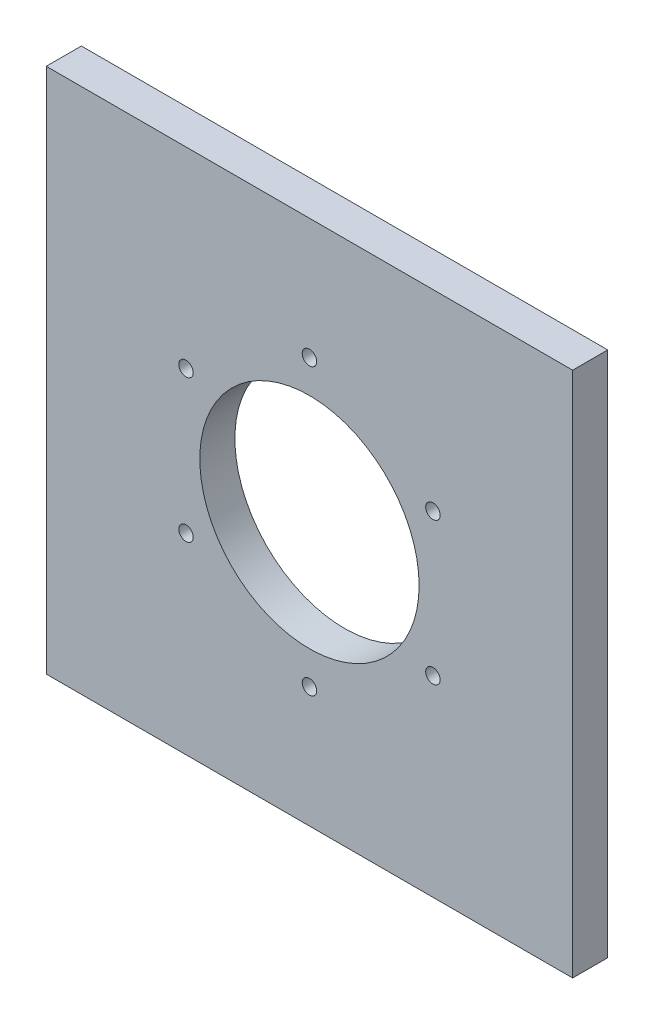
ISO-10303-21;
HEADER;
FILE_DESCRIPTION(('STEP AP214'),'2;1');
FILE_NAME('part.step','',(''),(''),'','','');
FILE_SCHEMA(('AUTOMOTIVE_DESIGN { 1 0 10303 214 1 1 1 1 }'));
ENDSEC;
DATA;
#1=APPLICATION_CONTEXT('core data for automotive mechanical design processes');
#2=APPLICATION_PROTOCOL_DEFINITION('international standard','automotive_design',2000,#1);
#3=PRODUCT_CONTEXT('',#1,'mechanical');
#4=PRODUCT('Part','Part','',(#3));
#5=PRODUCT_RELATED_PRODUCT_CATEGORY('part','',(#4));
#6=PRODUCT_DEFINITION_FORMATION('','',#4);
#7=PRODUCT_DEFINITION_CONTEXT('part definition',#1,'design');
#8=PRODUCT_DEFINITION('design','',#6,#7);
#9=PRODUCT_DEFINITION_SHAPE('','',#8);
#10=(LENGTH_UNIT() NAMED_UNIT(*) SI_UNIT(.MILLI.,.METRE.));
#11=(NAMED_UNIT(*) PLANE_ANGLE_UNIT() SI_UNIT($,.RADIAN.));
#12=(NAMED_UNIT(*) SI_UNIT($,.STERADIAN.) SOLID_ANGLE_UNIT());
#13=UNCERTAINTY_MEASURE_WITH_UNIT(LENGTH_MEASURE(1.E-05),#10,'distance_accuracy_value','');
#14=(GEOMETRIC_REPRESENTATION_CONTEXT(3) GLOBAL_UNCERTAINTY_ASSIGNED_CONTEXT((#13)) GLOBAL_UNIT_ASSIGNED_CONTEXT((#10,
#11,#12)) REPRESENTATION_CONTEXT('',''));
#15=CARTESIAN_POINT('',(0.,0.,0.));
#16=DIRECTION('',(0.,0.,1.));
#17=DIRECTION('',(1.,0.,0.));
#18=AXIS2_PLACEMENT_3D('',#15,#16,#17);
#19=CARTESIAN_POINT('',(0.,0.,8.));
#20=DIRECTION('',(0.,0.,1.));
#21=DIRECTION('',(1.,0.,0.));
#22=AXIS2_PLACEMENT_3D('',#19,#20,#21);
#23=PLANE('',#22);
#24=CARTESIAN_POINT('',(28.1458256229941,16.2500000000003,8.));
#25=DIRECTION('',(0.,0.,1.));
#26=DIRECTION('',(0.50000000000001,-0.866025403784433,0.));
#27=AXIS2_PLACEMENT_3D('',#24,#25,#26);
#28=CIRCLE('',#27,1.65);
#29=CARTESIAN_POINT('',(28.9708256229941,14.821058083756,8.));
#30=VERTEX_POINT('',#29);
#31=EDGE_CURVE('E158',#30,#30,#28,.T.);
#32=ORIENTED_EDGE('',*,*,#31,.F.);
#33=EDGE_LOOP('',(#32));
#34=FACE_BOUND('',#33,.T.);
#35=CARTESIAN_POINT('',(28.1458256229944,-16.2499999999997,8.));
#36=DIRECTION('',(0.,0.,1.));
#37=DIRECTION('',(-0.499999999999992,-0.866025403784443,0.));
#38=AXIS2_PLACEMENT_3D('',#35,#36,#37);
#39=CIRCLE('',#38,1.65);
#40=CARTESIAN_POINT('',(27.3208256229944,-17.6789419162441,8.));
#41=VERTEX_POINT('',#40);
#42=EDGE_CURVE('E166',#41,#41,#39,.T.);
#43=ORIENTED_EDGE('',*,*,#42,.F.);
#44=EDGE_LOOP('',(#43));
#45=FACE_BOUND('',#44,.T.);
#46=CARTESIAN_POINT('',(0.,-32.5,8.));
#47=DIRECTION('',(0.,0.,1.));
#48=DIRECTION('',(-1.,0.,0.));
#49=AXIS2_PLACEMENT_3D('',#46,#47,#48);
#50=CIRCLE('',#49,1.65);
#51=CARTESIAN_POINT('',(-1.64999999999999,-32.5,8.));
#52=VERTEX_POINT('',#51);
#53=EDGE_CURVE('E174',#52,#52,#50,.T.);
#54=ORIENTED_EDGE('',*,*,#53,.F.);
#55=EDGE_LOOP('',(#54));
#56=FACE_BOUND('',#55,.T.);
#57=CARTESIAN_POINT('',(-28.1458256229942,-16.2500000000001,8.));
#58=DIRECTION('',(0.,0.,1.));
#59=DIRECTION('',(-0.500000000000004,0.866025403784436,0.));
#60=AXIS2_PLACEMENT_3D('',#57,#58,#59);
#61=CIRCLE('',#60,1.65);
#62=CARTESIAN_POINT('',(-28.9708256229942,-14.8210580837558,8.));
#63=VERTEX_POINT('',#62);
#64=EDGE_CURVE('E150',#63,#63,#61,.T.);
#65=ORIENTED_EDGE('',*,*,#64,.F.);
#66=EDGE_LOOP('',(#65));
#67=FACE_BOUND('',#66,.T.);
#68=CARTESIAN_POINT('',(-28.1458256229943,16.2499999999999,8.));
#69=DIRECTION('',(0.,0.,1.));
#70=DIRECTION('',(0.499999999999998,0.86602540378444,0.));
#71=AXIS2_PLACEMENT_3D('',#68,#69,#70);
#72=CIRCLE('',#71,1.65);
#73=CARTESIAN_POINT('',(-27.3208256229943,17.6789419162442,8.));
#74=VERTEX_POINT('',#73);
#75=EDGE_CURVE('E142',#74,#74,#72,.T.);
#76=ORIENTED_EDGE('',*,*,#75,.F.);
#77=EDGE_LOOP('',(#76));
#78=FACE_BOUND('',#77,.T.);
#79=CARTESIAN_POINT('',(0.,32.5,8.));
#80=DIRECTION('',(0.,0.,1.));
#81=DIRECTION('',(1.,0.,0.));
#82=AXIS2_PLACEMENT_3D('',#79,#80,#81);
#83=CIRCLE('',#82,1.65);
#84=CARTESIAN_POINT('',(1.64999999999999,32.5,8.));
#85=VERTEX_POINT('',#84);
#86=EDGE_CURVE('E134',#85,#85,#83,.T.);
#87=ORIENTED_EDGE('',*,*,#86,.F.);
#88=EDGE_LOOP('',(#87));
#89=FACE_BOUND('',#88,.T.);
#90=DIRECTION('',(0.,1.,0.));
#91=VECTOR('',#90,1.);
#92=CARTESIAN_POINT('',(60.,60.,8.));
#93=LINE('',#92,#91);
#94=CARTESIAN_POINT('',(60.,-60.,8.));
#95=VERTEX_POINT('',#94);
#96=CARTESIAN_POINT('',(60.,60.,8.));
#97=VERTEX_POINT('',#96);
#98=EDGE_CURVE('E92',#95,#97,#93,.T.);
#99=ORIENTED_EDGE('',*,*,#98,.T.);
#100=DIRECTION('',(-1.,0.,0.));
#101=VECTOR('',#100,1.);
#102=CARTESIAN_POINT('',(-60.,60.,8.));
#103=LINE('',#102,#101);
#104=CARTESIAN_POINT('',(-60.,60.,8.));
#105=VERTEX_POINT('',#104);
#106=EDGE_CURVE('E87',#97,#105,#103,.T.);
#107=ORIENTED_EDGE('',*,*,#106,.T.);
#108=DIRECTION('',(0.,-1.,0.));
#109=VECTOR('',#108,1.);
#110=CARTESIAN_POINT('',(-60.,60.,8.));
#111=LINE('',#110,#109);
#112=CARTESIAN_POINT('',(-60.,-60.,8.));
#113=VERTEX_POINT('',#112);
#114=EDGE_CURVE('E90',#105,#113,#111,.T.);
#115=ORIENTED_EDGE('',*,*,#114,.T.);
#116=DIRECTION('',(1.,0.,0.));
#117=VECTOR('',#116,1.);
#118=CARTESIAN_POINT('',(-60.,-60.,8.));
#119=LINE('',#118,#117);
#120=EDGE_CURVE('E57',#113,#95,#119,.T.);
#121=ORIENTED_EDGE('',*,*,#120,.T.);
#122=EDGE_LOOP('',(#99,#107,#115,#121));
#123=FACE_BOUND('',#122,.T.);
#124=CARTESIAN_POINT('',(0.,0.,8.));
#125=DIRECTION('',(0.,0.,1.));
#126=DIRECTION('',(1.,0.,0.));
#127=AXIS2_PLACEMENT_3D('',#124,#125,#126);
#128=CIRCLE('',#127,25.);
#129=CARTESIAN_POINT('',(25.,0.,8.));
#130=VERTEX_POINT('',#129);
#131=EDGE_CURVE('E112',#130,#130,#128,.T.);
#132=ORIENTED_EDGE('',*,*,#131,.F.);
#133=EDGE_LOOP('',(#132));
#134=FACE_BOUND('',#133,.T.);
#135=ADVANCED_FACE('F39',(#34,#45,#56,#67,#78,#89,#123,#134),#23,.T.);
#136=CARTESIAN_POINT('',(0.,0.,0.));
#137=DIRECTION('',(0.,0.,1.));
#138=DIRECTION('',(1.,0.,0.));
#139=AXIS2_PLACEMENT_3D('',#136,#137,#138);
#140=PLANE('',#139);
#141=CARTESIAN_POINT('',(28.1458256229941,16.2500000000003,0.));
#142=DIRECTION('',(0.,0.,1.));
#143=DIRECTION('',(0.50000000000001,-0.866025403784433,0.));
#144=AXIS2_PLACEMENT_3D('',#141,#142,#143);
#145=CIRCLE('',#144,1.65);
#146=CARTESIAN_POINT('',(28.9708256229941,14.821058083756,0.));
#147=VERTEX_POINT('',#146);
#148=EDGE_CURVE('E154',#147,#147,#145,.T.);
#149=ORIENTED_EDGE('',*,*,#148,.T.);
#150=EDGE_LOOP('',(#149));
#151=FACE_BOUND('',#150,.T.);
#152=CARTESIAN_POINT('',(28.1458256229944,-16.2499999999997,0.));
#153=DIRECTION('',(0.,0.,1.));
#154=DIRECTION('',(-0.499999999999992,-0.866025403784443,0.));
#155=AXIS2_PLACEMENT_3D('',#152,#153,#154);
#156=CIRCLE('',#155,1.65);
#157=CARTESIAN_POINT('',(27.3208256229944,-17.6789419162441,0.));
#158=VERTEX_POINT('',#157);
#159=EDGE_CURVE('E162',#158,#158,#156,.T.);
#160=ORIENTED_EDGE('',*,*,#159,.T.);
#161=EDGE_LOOP('',(#160));
#162=FACE_BOUND('',#161,.T.);
#163=CARTESIAN_POINT('',(0.,-32.5,0.));
#164=DIRECTION('',(0.,0.,1.));
#165=DIRECTION('',(-1.,0.,0.));
#166=AXIS2_PLACEMENT_3D('',#163,#164,#165);
#167=CIRCLE('',#166,1.65);
#168=CARTESIAN_POINT('',(-1.64999999999999,-32.5,0.));
#169=VERTEX_POINT('',#168);
#170=EDGE_CURVE('E170',#169,#169,#167,.T.);
#171=ORIENTED_EDGE('',*,*,#170,.T.);
#172=EDGE_LOOP('',(#171));
#173=FACE_BOUND('',#172,.T.);
#174=CARTESIAN_POINT('',(-28.1458256229942,-16.2500000000001,0.));
#175=DIRECTION('',(0.,0.,1.));
#176=DIRECTION('',(-0.500000000000004,0.866025403784436,0.));
#177=AXIS2_PLACEMENT_3D('',#174,#175,#176);
#178=CIRCLE('',#177,1.65);
#179=CARTESIAN_POINT('',(-28.9708256229942,-14.8210580837558,0.));
#180=VERTEX_POINT('',#179);
#181=EDGE_CURVE('E178',#180,#180,#178,.T.);
#182=ORIENTED_EDGE('',*,*,#181,.T.);
#183=EDGE_LOOP('',(#182));
#184=FACE_BOUND('',#183,.T.);
#185=CARTESIAN_POINT('',(-28.1458256229943,16.2499999999999,0.));
#186=DIRECTION('',(0.,0.,1.));
#187=DIRECTION('',(0.499999999999998,0.86602540378444,0.));
#188=AXIS2_PLACEMENT_3D('',#185,#186,#187);
#189=CIRCLE('',#188,1.65);
#190=CARTESIAN_POINT('',(-27.3208256229943,17.6789419162442,0.));
#191=VERTEX_POINT('',#190);
#192=EDGE_CURVE('E146',#191,#191,#189,.T.);
#193=ORIENTED_EDGE('',*,*,#192,.T.);
#194=EDGE_LOOP('',(#193));
#195=FACE_BOUND('',#194,.T.);
#196=CARTESIAN_POINT('',(0.,32.5,0.));
#197=DIRECTION('',(0.,0.,1.));
#198=DIRECTION('',(1.,0.,0.));
#199=AXIS2_PLACEMENT_3D('',#196,#197,#198);
#200=CIRCLE('',#199,1.65);
#201=CARTESIAN_POINT('',(1.64999999999999,32.5,0.));
#202=VERTEX_POINT('',#201);
#203=EDGE_CURVE('E138',#202,#202,#200,.T.);
#204=ORIENTED_EDGE('',*,*,#203,.T.);
#205=EDGE_LOOP('',(#204));
#206=FACE_BOUND('',#205,.T.);
#207=DIRECTION('',(0.,1.,0.));
#208=VECTOR('',#207,1.);
#209=CARTESIAN_POINT('',(60.,60.,0.));
#210=LINE('',#209,#208);
#211=CARTESIAN_POINT('',(60.,-60.,0.));
#212=VERTEX_POINT('',#211);
#213=CARTESIAN_POINT('',(60.,60.,0.));
#214=VERTEX_POINT('',#213);
#215=EDGE_CURVE('E108',#212,#214,#210,.T.);
#216=ORIENTED_EDGE('',*,*,#215,.F.);
#217=DIRECTION('',(1.,0.,0.));
#218=VECTOR('',#217,1.);
#219=CARTESIAN_POINT('',(-60.,-60.,0.));
#220=LINE('',#219,#218);
#221=CARTESIAN_POINT('',(-60.,-60.,0.));
#222=VERTEX_POINT('',#221);
#223=EDGE_CURVE('E80',#222,#212,#220,.T.);
#224=ORIENTED_EDGE('',*,*,#223,.F.);
#225=DIRECTION('',(0.,-1.,0.));
#226=VECTOR('',#225,1.);
#227=CARTESIAN_POINT('',(-60.,60.,0.));
#228=LINE('',#227,#226);
#229=CARTESIAN_POINT('',(-60.,60.,0.));
#230=VERTEX_POINT('',#229);
#231=EDGE_CURVE('E74',#230,#222,#228,.T.);
#232=ORIENTED_EDGE('',*,*,#231,.F.);
#233=DIRECTION('',(-1.,0.,0.));
#234=VECTOR('',#233,1.);
#235=CARTESIAN_POINT('',(-60.,60.,0.));
#236=LINE('',#235,#234);
#237=EDGE_CURVE('E97',#214,#230,#236,.T.);
#238=ORIENTED_EDGE('',*,*,#237,.F.);
#239=EDGE_LOOP('',(#216,#224,#232,#238));
#240=FACE_BOUND('',#239,.T.);
#241=CARTESIAN_POINT('',(0.,0.,0.));
#242=DIRECTION('',(0.,0.,1.));
#243=DIRECTION('',(1.,0.,0.));
#244=AXIS2_PLACEMENT_3D('',#241,#242,#243);
#245=CIRCLE('',#244,25.);
#246=CARTESIAN_POINT('',(25.,0.,0.));
#247=VERTEX_POINT('',#246);
#248=EDGE_CURVE('E130',#247,#247,#245,.T.);
#249=ORIENTED_EDGE('',*,*,#248,.T.);
#250=EDGE_LOOP('',(#249));
#251=FACE_BOUND('',#250,.T.);
#252=ADVANCED_FACE('F125',(#151,#162,#173,#184,#195,#206,#240,#251),#140,.F.);
#253=CARTESIAN_POINT('',(60.,60.,8.));
#254=DIRECTION('',(-1.,0.,0.));
#255=DIRECTION('',(0.,-1.,0.));
#256=AXIS2_PLACEMENT_3D('',#253,#254,#255);
#257=PLANE('',#256);
#258=ORIENTED_EDGE('',*,*,#215,.T.);
#259=DIRECTION('',(0.,0.,-1.));
#260=VECTOR('',#259,1.);
#261=CARTESIAN_POINT('',(60.,60.,8.));
#262=LINE('',#261,#260);
#263=EDGE_CURVE('E11',#97,#214,#262,.T.);
#264=ORIENTED_EDGE('',*,*,#263,.F.);
#265=ORIENTED_EDGE('',*,*,#98,.F.);
#266=DIRECTION('',(0.,0.,-1.));
#267=VECTOR('',#266,1.);
#268=CARTESIAN_POINT('',(60.,-60.,8.));
#269=LINE('',#268,#267);
#270=EDGE_CURVE('E104',#95,#212,#269,.T.);
#271=ORIENTED_EDGE('',*,*,#270,.T.);
#272=EDGE_LOOP('',(#258,#264,#265,#271));
#273=FACE_BOUND('',#272,.T.);
#274=ADVANCED_FACE('F41',(#273),#257,.F.);
#275=CARTESIAN_POINT('',(-60.,60.,8.));
#276=DIRECTION('',(0.,-1.,0.));
#277=DIRECTION('',(0.,0.,-1.));
#278=AXIS2_PLACEMENT_3D('',#275,#276,#277);
#279=PLANE('',#278);
#280=ORIENTED_EDGE('',*,*,#237,.T.);
#281=DIRECTION('',(0.,0.,-1.));
#282=VECTOR('',#281,1.);
#283=CARTESIAN_POINT('',(-60.,60.,8.));
#284=LINE('',#283,#282);
#285=EDGE_CURVE('E49',#105,#230,#284,.T.);
#286=ORIENTED_EDGE('',*,*,#285,.F.);
#287=ORIENTED_EDGE('',*,*,#106,.F.);
#288=ORIENTED_EDGE('',*,*,#263,.T.);
#289=EDGE_LOOP('',(#280,#286,#287,#288));
#290=FACE_BOUND('',#289,.T.);
#291=ADVANCED_FACE('F96',(#290),#279,.F.);
#292=CARTESIAN_POINT('',(-60.,60.,8.));
#293=DIRECTION('',(1.,0.,0.));
#294=DIRECTION('',(0.,1.,0.));
#295=AXIS2_PLACEMENT_3D('',#292,#293,#294);
#296=PLANE('',#295);
#297=ORIENTED_EDGE('',*,*,#231,.T.);
#298=DIRECTION('',(0.,0.,-1.));
#299=VECTOR('',#298,1.);
#300=CARTESIAN_POINT('',(-60.,-60.,8.));
#301=LINE('',#300,#299);
#302=EDGE_CURVE('E99',#113,#222,#301,.T.);
#303=ORIENTED_EDGE('',*,*,#302,.F.);
#304=ORIENTED_EDGE('',*,*,#114,.F.);
#305=ORIENTED_EDGE('',*,*,#285,.T.);
#306=EDGE_LOOP('',(#297,#303,#304,#305));
#307=FACE_BOUND('',#306,.T.);
#308=ADVANCED_FACE('F100',(#307),#296,.F.);
#309=CARTESIAN_POINT('',(-60.,-60.,8.));
#310=DIRECTION('',(0.,1.,0.));
#311=DIRECTION('',(0.,0.,1.));
#312=AXIS2_PLACEMENT_3D('',#309,#310,#311);
#313=PLANE('',#312);
#314=ORIENTED_EDGE('',*,*,#223,.T.);
#315=ORIENTED_EDGE('',*,*,#270,.F.);
#316=ORIENTED_EDGE('',*,*,#120,.F.);
#317=ORIENTED_EDGE('',*,*,#302,.T.);
#318=EDGE_LOOP('',(#314,#315,#316,#317));
#319=FACE_BOUND('',#318,.T.);
#320=ADVANCED_FACE('F122',(#319),#313,.F.);
#321=CARTESIAN_POINT('',(0.,0.,8.));
#322=DIRECTION('',(0.,0.,-1.));
#323=DIRECTION('',(-1.,0.,0.));
#324=AXIS2_PLACEMENT_3D('',#321,#322,#323);
#325=CYLINDRICAL_SURFACE('',#324,25.);
#326=ORIENTED_EDGE('',*,*,#131,.T.);
#327=EDGE_LOOP('',(#326));
#328=FACE_BOUND('',#327,.T.);
#329=ORIENTED_EDGE('',*,*,#248,.F.);
#330=EDGE_LOOP('',(#329));
#331=FACE_BOUND('',#330,.T.);
#332=ADVANCED_FACE('F201',(#328,#331),#325,.F.);
#333=CARTESIAN_POINT('',(0.,32.5,8.));
#334=DIRECTION('',(0.,0.,-1.));
#335=DIRECTION('',(-1.,0.,0.));
#336=AXIS2_PLACEMENT_3D('',#333,#334,#335);
#337=CYLINDRICAL_SURFACE('',#336,1.65);
#338=ORIENTED_EDGE('',*,*,#86,.T.);
#339=EDGE_LOOP('',(#338));
#340=FACE_BOUND('',#339,.T.);
#341=ORIENTED_EDGE('',*,*,#203,.F.);
#342=EDGE_LOOP('',(#341));
#343=FACE_BOUND('',#342,.T.);
#344=ADVANCED_FACE('F197',(#340,#343),#337,.F.);
#345=CARTESIAN_POINT('',(-28.1458256229943,16.2499999999999,8.));
#346=DIRECTION('',(0.,0.,-1.));
#347=DIRECTION('',(-1.,0.,0.));
#348=AXIS2_PLACEMENT_3D('',#345,#346,#347);
#349=CYLINDRICAL_SURFACE('',#348,1.65);
#350=ORIENTED_EDGE('',*,*,#75,.T.);
#351=EDGE_LOOP('',(#350));
#352=FACE_BOUND('',#351,.T.);
#353=ORIENTED_EDGE('',*,*,#192,.F.);
#354=EDGE_LOOP('',(#353));
#355=FACE_BOUND('',#354,.T.);
#356=ADVANCED_FACE('F200',(#352,#355),#349,.F.);
#357=CARTESIAN_POINT('',(-28.1458256229942,-16.2500000000001,8.));
#358=DIRECTION('',(0.,0.,-1.));
#359=DIRECTION('',(-1.,0.,0.));
#360=AXIS2_PLACEMENT_3D('',#357,#358,#359);
#361=CYLINDRICAL_SURFACE('',#360,1.65);
#362=ORIENTED_EDGE('',*,*,#64,.T.);
#363=EDGE_LOOP('',(#362));
#364=FACE_BOUND('',#363,.T.);
#365=ORIENTED_EDGE('',*,*,#181,.F.);
#366=EDGE_LOOP('',(#365));
#367=FACE_BOUND('',#366,.T.);
#368=ADVANCED_FACE('F186',(#364,#367),#361,.F.);
#369=CARTESIAN_POINT('',(0.,-32.5,8.));
#370=DIRECTION('',(0.,0.,-1.));
#371=DIRECTION('',(-1.,0.,0.));
#372=AXIS2_PLACEMENT_3D('',#369,#370,#371);
#373=CYLINDRICAL_SURFACE('',#372,1.65);
#374=ORIENTED_EDGE('',*,*,#53,.T.);
#375=EDGE_LOOP('',(#374));
#376=FACE_BOUND('',#375,.T.);
#377=ORIENTED_EDGE('',*,*,#170,.F.);
#378=EDGE_LOOP('',(#377));
#379=FACE_BOUND('',#378,.T.);
#380=ADVANCED_FACE('F254',(#376,#379),#373,.F.);
#381=CARTESIAN_POINT('',(28.1458256229944,-16.2499999999997,8.));
#382=DIRECTION('',(0.,0.,-1.));
#383=DIRECTION('',(-1.,0.,0.));
#384=AXIS2_PLACEMENT_3D('',#381,#382,#383);
#385=CYLINDRICAL_SURFACE('',#384,1.65);
#386=ORIENTED_EDGE('',*,*,#42,.T.);
#387=EDGE_LOOP('',(#386));
#388=FACE_BOUND('',#387,.T.);
#389=ORIENTED_EDGE('',*,*,#159,.F.);
#390=EDGE_LOOP('',(#389));
#391=FACE_BOUND('',#390,.T.);
#392=ADVANCED_FACE('F261',(#388,#391),#385,.F.);
#393=CARTESIAN_POINT('',(28.1458256229941,16.2500000000003,8.));
#394=DIRECTION('',(0.,0.,-1.));
#395=DIRECTION('',(-1.,0.,0.));
#396=AXIS2_PLACEMENT_3D('',#393,#394,#395);
#397=CYLINDRICAL_SURFACE('',#396,1.65);
#398=ORIENTED_EDGE('',*,*,#31,.T.);
#399=EDGE_LOOP('',(#398));
#400=FACE_BOUND('',#399,.T.);
#401=ORIENTED_EDGE('',*,*,#148,.F.);
#402=EDGE_LOOP('',(#401));
#403=FACE_BOUND('',#402,.T.);
#404=ADVANCED_FACE('F269',(#400,#403),#397,.F.);
#405=CLOSED_SHELL('',(#135,#252,#274,#291,#308,#320,#332,#344,#356,#368,#380,#392,#404));
#406=MANIFOLD_SOLID_BREP('B2',#405);
#407=ADVANCED_BREP_SHAPE_REPRESENTATION('',(#18,#406),#14);
#408=SHAPE_DEFINITION_REPRESENTATION(#9,#407);
ENDSEC;
END-ISO-10303-21;
